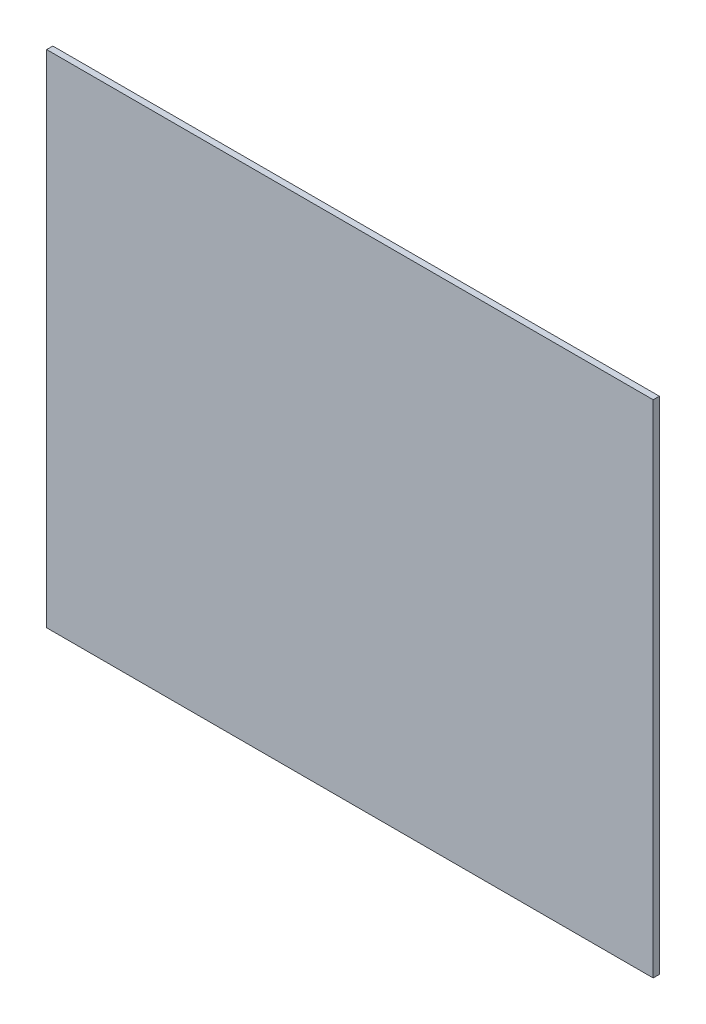
ISO-10303-21;
HEADER;
FILE_DESCRIPTION(('STEP AP214'),'2;1');
FILE_NAME('part.step','',(''),(''),'','','');
FILE_SCHEMA(('AUTOMOTIVE_DESIGN { 1 0 10303 214 1 1 1 1 }'));
ENDSEC;
DATA;
#1=APPLICATION_CONTEXT('core data for automotive mechanical design processes');
#2=APPLICATION_PROTOCOL_DEFINITION('international standard','automotive_design',2000,#1);
#3=PRODUCT_CONTEXT('',#1,'mechanical');
#4=PRODUCT('Part','Part','',(#3));
#5=PRODUCT_RELATED_PRODUCT_CATEGORY('part','',(#4));
#6=PRODUCT_DEFINITION_FORMATION('','',#4);
#7=PRODUCT_DEFINITION_CONTEXT('part definition',#1,'design');
#8=PRODUCT_DEFINITION('design','',#6,#7);
#9=PRODUCT_DEFINITION_SHAPE('','',#8);
#10=(LENGTH_UNIT() NAMED_UNIT(*) SI_UNIT(.MILLI.,.METRE.));
#11=(NAMED_UNIT(*) PLANE_ANGLE_UNIT() SI_UNIT($,.RADIAN.));
#12=(NAMED_UNIT(*) SI_UNIT($,.STERADIAN.) SOLID_ANGLE_UNIT());
#13=UNCERTAINTY_MEASURE_WITH_UNIT(LENGTH_MEASURE(1.E-05),#10,'distance_accuracy_value','');
#14=(GEOMETRIC_REPRESENTATION_CONTEXT(3) GLOBAL_UNCERTAINTY_ASSIGNED_CONTEXT((#13)) GLOBAL_UNIT_ASSIGNED_CONTEXT((#10,
#11,#12)) REPRESENTATION_CONTEXT('',''));
#15=CARTESIAN_POINT('',(0.,0.,0.));
#16=DIRECTION('',(0.,0.,1.));
#17=DIRECTION('',(1.,0.,0.));
#18=AXIS2_PLACEMENT_3D('',#15,#16,#17);
#19=CARTESIAN_POINT('',(8.2291125589919,-276.44052693095,3.));
#20=DIRECTION('',(1.,0.,0.));
#21=DIRECTION('',(0.,0.,-1.));
#22=AXIS2_PLACEMENT_3D('',#19,#20,#21);
#23=PLANE('',#22);
#24=DIRECTION('',(0.,-1.,0.));
#25=VECTOR('',#24,1.);
#26=CARTESIAN_POINT('',(8.2291125589919,-276.44052693095,0.));
#27=LINE('',#26,#25);
#28=CARTESIAN_POINT('',(8.2291125589919,-276.44052693095,0.));
#29=VERTEX_POINT('',#28);
#30=CARTESIAN_POINT('',(8.2291125589919,-520.,0.));
#31=VERTEX_POINT('',#30);
#32=EDGE_CURVE('E97',#29,#31,#27,.T.);
#33=ORIENTED_EDGE('',*,*,#32,.T.);
#34=DIRECTION('',(0.,0.,-1.));
#35=VECTOR('',#34,1.);
#36=CARTESIAN_POINT('',(8.2291125589919,-520.,3.));
#37=LINE('',#36,#35);
#38=CARTESIAN_POINT('',(8.2291125589919,-520.,3.));
#39=VERTEX_POINT('',#38);
#40=EDGE_CURVE('E11',#39,#31,#37,.T.);
#41=ORIENTED_EDGE('',*,*,#40,.F.);
#42=DIRECTION('',(0.,-1.,0.));
#43=VECTOR('',#42,1.);
#44=CARTESIAN_POINT('',(8.2291125589919,-276.44052693095,3.));
#45=LINE('',#44,#43);
#46=CARTESIAN_POINT('',(8.2291125589919,-276.44052693095,3.));
#47=VERTEX_POINT('',#46);
#48=EDGE_CURVE('E85',#47,#39,#45,.T.);
#49=ORIENTED_EDGE('',*,*,#48,.F.);
#50=DIRECTION('',(0.,0.,-1.));
#51=VECTOR('',#50,1.);
#52=CARTESIAN_POINT('',(8.2291125589919,-276.44052693095,3.));
#53=LINE('',#52,#51);
#54=EDGE_CURVE('E93',#47,#29,#53,.T.);
#55=ORIENTED_EDGE('',*,*,#54,.T.);
#56=EDGE_LOOP('',(#33,#41,#49,#55));
#57=FACE_BOUND('',#56,.T.);
#58=ADVANCED_FACE('F34',(#57),#23,.F.);
#59=CARTESIAN_POINT('',(8.2291125589919,-520.,3.));
#60=DIRECTION('',(0.,1.,0.));
#61=DIRECTION('',(0.,0.,1.));
#62=AXIS2_PLACEMENT_3D('',#59,#60,#61);
#63=PLANE('',#62);
#64=DIRECTION('',(1.,0.,0.));
#65=VECTOR('',#64,1.);
#66=CARTESIAN_POINT('',(8.2291125589919,-520.,0.));
#67=LINE('',#66,#65);
#68=CARTESIAN_POINT('',(303.229112558992,-520.,0.));
#69=VERTEX_POINT('',#68);
#70=EDGE_CURVE('E89',#31,#69,#67,.T.);
#71=ORIENTED_EDGE('',*,*,#70,.T.);
#72=DIRECTION('',(0.,0.,-1.));
#73=VECTOR('',#72,1.);
#74=CARTESIAN_POINT('',(303.229112558992,-520.,3.));
#75=LINE('',#74,#73);
#76=CARTESIAN_POINT('',(303.229112558992,-520.,3.));
#77=VERTEX_POINT('',#76);
#78=EDGE_CURVE('E42',#77,#69,#75,.T.);
#79=ORIENTED_EDGE('',*,*,#78,.F.);
#80=DIRECTION('',(1.,0.,0.));
#81=VECTOR('',#80,1.);
#82=CARTESIAN_POINT('',(8.2291125589919,-520.,3.));
#83=LINE('',#82,#81);
#84=EDGE_CURVE('E80',#39,#77,#83,.T.);
#85=ORIENTED_EDGE('',*,*,#84,.F.);
#86=ORIENTED_EDGE('',*,*,#40,.T.);
#87=EDGE_LOOP('',(#71,#79,#85,#86));
#88=FACE_BOUND('',#87,.T.);
#89=ADVANCED_FACE('F88',(#88),#63,.F.);
#90=CARTESIAN_POINT('',(303.229112558992,-276.44052693095,3.));
#91=DIRECTION('',(-1.,0.,0.));
#92=DIRECTION('',(0.,0.,1.));
#93=AXIS2_PLACEMENT_3D('',#90,#91,#92);
#94=PLANE('',#93);
#95=DIRECTION('',(0.,1.,0.));
#96=VECTOR('',#95,1.);
#97=CARTESIAN_POINT('',(303.229112558992,-276.44052693095,0.));
#98=LINE('',#97,#96);
#99=CARTESIAN_POINT('',(303.229112558992,-276.44052693095,0.));
#100=VERTEX_POINT('',#99);
#101=EDGE_CURVE('E67',#69,#100,#98,.T.);
#102=ORIENTED_EDGE('',*,*,#101,.T.);
#103=DIRECTION('',(0.,0.,-1.));
#104=VECTOR('',#103,1.);
#105=CARTESIAN_POINT('',(303.229112558992,-276.44052693095,3.));
#106=LINE('',#105,#104);
#107=CARTESIAN_POINT('',(303.229112558992,-276.44052693095,3.));
#108=VERTEX_POINT('',#107);
#109=EDGE_CURVE('E90',#108,#100,#106,.T.);
#110=ORIENTED_EDGE('',*,*,#109,.F.);
#111=DIRECTION('',(0.,1.,0.));
#112=VECTOR('',#111,1.);
#113=CARTESIAN_POINT('',(303.229112558992,-276.44052693095,3.));
#114=LINE('',#113,#112);
#115=EDGE_CURVE('E83',#77,#108,#114,.T.);
#116=ORIENTED_EDGE('',*,*,#115,.F.);
#117=ORIENTED_EDGE('',*,*,#78,.T.);
#118=EDGE_LOOP('',(#102,#110,#116,#117));
#119=FACE_BOUND('',#118,.T.);
#120=ADVANCED_FACE('F91',(#119),#94,.F.);
#121=CARTESIAN_POINT('',(8.2291125589919,-276.44052693095,3.));
#122=DIRECTION('',(0.,-1.,0.));
#123=DIRECTION('',(0.,0.,-1.));
#124=AXIS2_PLACEMENT_3D('',#121,#122,#123);
#125=PLANE('',#124);
#126=DIRECTION('',(-1.,0.,0.));
#127=VECTOR('',#126,1.);
#128=CARTESIAN_POINT('',(8.2291125589919,-276.44052693095,0.));
#129=LINE('',#128,#127);
#130=EDGE_CURVE('E73',#100,#29,#129,.T.);
#131=ORIENTED_EDGE('',*,*,#130,.T.);
#132=ORIENTED_EDGE('',*,*,#54,.F.);
#133=DIRECTION('',(-1.,0.,0.));
#134=VECTOR('',#133,1.);
#135=CARTESIAN_POINT('',(8.2291125589919,-276.44052693095,3.));
#136=LINE('',#135,#134);
#137=EDGE_CURVE('E50',#108,#47,#136,.T.);
#138=ORIENTED_EDGE('',*,*,#137,.F.);
#139=ORIENTED_EDGE('',*,*,#109,.T.);
#140=EDGE_LOOP('',(#131,#132,#138,#139));
#141=FACE_BOUND('',#140,.T.);
#142=ADVANCED_FACE('F104',(#141),#125,.F.);
#143=CARTESIAN_POINT('',(0.,0.,3.));
#144=DIRECTION('',(0.,0.,1.));
#145=DIRECTION('',(1.,0.,0.));
#146=AXIS2_PLACEMENT_3D('',#143,#144,#145);
#147=PLANE('',#146);
#148=ORIENTED_EDGE('',*,*,#48,.T.);
#149=ORIENTED_EDGE('',*,*,#84,.T.);
#150=ORIENTED_EDGE('',*,*,#115,.T.);
#151=ORIENTED_EDGE('',*,*,#137,.T.);
#152=EDGE_LOOP('',(#148,#149,#150,#151));
#153=FACE_BOUND('',#152,.T.);
#154=ADVANCED_FACE('F81',(#153),#147,.T.);
#155=CARTESIAN_POINT('',(0.,0.,0.));
#156=DIRECTION('',(0.,0.,1.));
#157=DIRECTION('',(1.,0.,0.));
#158=AXIS2_PLACEMENT_3D('',#155,#156,#157);
#159=PLANE('',#158);
#160=ORIENTED_EDGE('',*,*,#32,.F.);
#161=ORIENTED_EDGE('',*,*,#130,.F.);
#162=ORIENTED_EDGE('',*,*,#101,.F.);
#163=ORIENTED_EDGE('',*,*,#70,.F.);
#164=EDGE_LOOP('',(#160,#161,#162,#163));
#165=FACE_BOUND('',#164,.T.);
#166=ADVANCED_FACE('F107',(#165),#159,.F.);
#167=CLOSED_SHELL('',(#58,#89,#120,#142,#154,#166));
#168=MANIFOLD_SOLID_BREP('B2',#167);
#169=ADVANCED_BREP_SHAPE_REPRESENTATION('',(#18,#168),#14);
#170=SHAPE_DEFINITION_REPRESENTATION(#9,#169);
ENDSEC;
END-ISO-10303-21;
